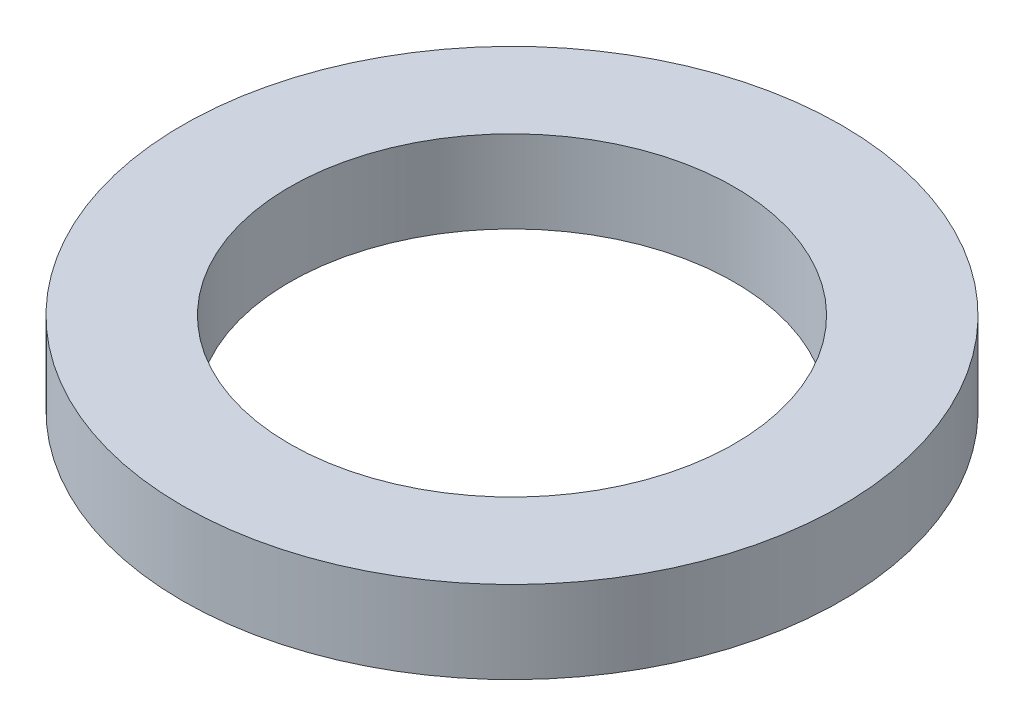
ISO-10303-21;
HEADER;
FILE_DESCRIPTION(('STEP AP214'),'2;1');
FILE_NAME('part.step','',(''),(''),'','','');
FILE_SCHEMA(('AUTOMOTIVE_DESIGN { 1 0 10303 214 1 1 1 1 }'));
ENDSEC;
DATA;
#1=APPLICATION_CONTEXT('core data for automotive mechanical design processes');
#2=APPLICATION_PROTOCOL_DEFINITION('international standard','automotive_design',2000,#1);
#3=PRODUCT_CONTEXT('',#1,'mechanical');
#4=PRODUCT('Part','Part','',(#3));
#5=PRODUCT_RELATED_PRODUCT_CATEGORY('part','',(#4));
#6=PRODUCT_DEFINITION_FORMATION('','',#4);
#7=PRODUCT_DEFINITION_CONTEXT('part definition',#1,'design');
#8=PRODUCT_DEFINITION('design','',#6,#7);
#9=PRODUCT_DEFINITION_SHAPE('','',#8);
#10=(LENGTH_UNIT() NAMED_UNIT(*) SI_UNIT(.MILLI.,.METRE.));
#11=(NAMED_UNIT(*) PLANE_ANGLE_UNIT() SI_UNIT($,.RADIAN.));
#12=(NAMED_UNIT(*) SI_UNIT($,.STERADIAN.) SOLID_ANGLE_UNIT());
#13=UNCERTAINTY_MEASURE_WITH_UNIT(LENGTH_MEASURE(1.E-05),#10,'distance_accuracy_value','');
#14=(GEOMETRIC_REPRESENTATION_CONTEXT(3) GLOBAL_UNCERTAINTY_ASSIGNED_CONTEXT((#13)) GLOBAL_UNIT_ASSIGNED_CONTEXT((#10,
#11,#12)) REPRESENTATION_CONTEXT('',''));
#15=CARTESIAN_POINT('',(0.,0.,0.));
#16=DIRECTION('',(0.,0.,1.));
#17=DIRECTION('',(1.,0.,0.));
#18=AXIS2_PLACEMENT_3D('',#15,#16,#17);
#19=CARTESIAN_POINT('',(0.,1.,0.));
#20=DIRECTION('',(0.,1.,0.));
#21=DIRECTION('',(0.,0.,1.));
#22=AXIS2_PLACEMENT_3D('',#19,#20,#21);
#23=PLANE('',#22);
#24=CARTESIAN_POINT('',(0.,1.,0.));
#25=DIRECTION('',(0.,1.,0.));
#26=DIRECTION('',(0.,0.,1.));
#27=AXIS2_PLACEMENT_3D('',#24,#25,#26);
#28=CIRCLE('',#27,4.);
#29=CARTESIAN_POINT('',(0.,1.,4.));
#30=VERTEX_POINT('',#29);
#31=EDGE_CURVE('E10',#30,#30,#28,.T.);
#32=ORIENTED_EDGE('',*,*,#31,.T.);
#33=EDGE_LOOP('',(#32));
#34=FACE_BOUND('',#33,.T.);
#35=CARTESIAN_POINT('',(0.,1.,0.));
#36=DIRECTION('',(0.,1.,0.));
#37=DIRECTION('',(0.,0.,1.));
#38=AXIS2_PLACEMENT_3D('',#35,#36,#37);
#39=CIRCLE('',#38,2.7);
#40=CARTESIAN_POINT('',(0.,1.,2.7));
#41=VERTEX_POINT('',#40);
#42=EDGE_CURVE('E56',#41,#41,#39,.T.);
#43=ORIENTED_EDGE('',*,*,#42,.F.);
#44=EDGE_LOOP('',(#43));
#45=FACE_BOUND('',#44,.T.);
#46=ADVANCED_FACE('F43',(#34,#45),#23,.T.);
#47=CARTESIAN_POINT('',(0.,0.,0.));
#48=DIRECTION('',(0.,1.,0.));
#49=DIRECTION('',(0.,0.,1.));
#50=AXIS2_PLACEMENT_3D('',#47,#48,#49);
#51=PLANE('',#50);
#52=CARTESIAN_POINT('',(0.,0.,0.));
#53=DIRECTION('',(0.,1.,0.));
#54=DIRECTION('',(0.,0.,1.));
#55=AXIS2_PLACEMENT_3D('',#52,#53,#54);
#56=CIRCLE('',#55,4.);
#57=CARTESIAN_POINT('',(0.,0.,4.));
#58=VERTEX_POINT('',#57);
#59=EDGE_CURVE('E47',#58,#58,#56,.T.);
#60=ORIENTED_EDGE('',*,*,#59,.F.);
#61=EDGE_LOOP('',(#60));
#62=FACE_BOUND('',#61,.T.);
#63=CARTESIAN_POINT('',(0.,0.,0.));
#64=DIRECTION('',(0.,1.,0.));
#65=DIRECTION('',(0.,0.,1.));
#66=AXIS2_PLACEMENT_3D('',#63,#64,#65);
#67=CIRCLE('',#66,2.7);
#68=CARTESIAN_POINT('',(0.,0.,2.7));
#69=VERTEX_POINT('',#68);
#70=EDGE_CURVE('E58',#69,#69,#67,.T.);
#71=ORIENTED_EDGE('',*,*,#70,.T.);
#72=EDGE_LOOP('',(#71));
#73=FACE_BOUND('',#72,.T.);
#74=ADVANCED_FACE('F70',(#62,#73),#51,.F.);
#75=CARTESIAN_POINT('',(0.,1.,0.));
#76=DIRECTION('',(0.,-1.,0.));
#77=DIRECTION('',(0.,0.,-1.));
#78=AXIS2_PLACEMENT_3D('',#75,#76,#77);
#79=CYLINDRICAL_SURFACE('',#78,4.);
#80=ORIENTED_EDGE('',*,*,#31,.F.);
#81=EDGE_LOOP('',(#80));
#82=FACE_BOUND('',#81,.T.);
#83=ORIENTED_EDGE('',*,*,#59,.T.);
#84=EDGE_LOOP('',(#83));
#85=FACE_BOUND('',#84,.T.);
#86=ADVANCED_FACE('F45',(#82,#85),#79,.T.);
#87=CARTESIAN_POINT('',(0.,1.,0.));
#88=DIRECTION('',(0.,-1.,0.));
#89=DIRECTION('',(0.,0.,-1.));
#90=AXIS2_PLACEMENT_3D('',#87,#88,#89);
#91=CYLINDRICAL_SURFACE('',#90,2.7);
#92=ORIENTED_EDGE('',*,*,#42,.T.);
#93=EDGE_LOOP('',(#92));
#94=FACE_BOUND('',#93,.T.);
#95=ORIENTED_EDGE('',*,*,#70,.F.);
#96=EDGE_LOOP('',(#95));
#97=FACE_BOUND('',#96,.T.);
#98=ADVANCED_FACE('F66',(#94,#97),#91,.F.);
#99=CLOSED_SHELL('',(#46,#74,#86,#98));
#100=MANIFOLD_SOLID_BREP('B2',#99);
#101=ADVANCED_BREP_SHAPE_REPRESENTATION('',(#18,#100),#14);
#102=SHAPE_DEFINITION_REPRESENTATION(#9,#101);
ENDSEC;
END-ISO-10303-21;
